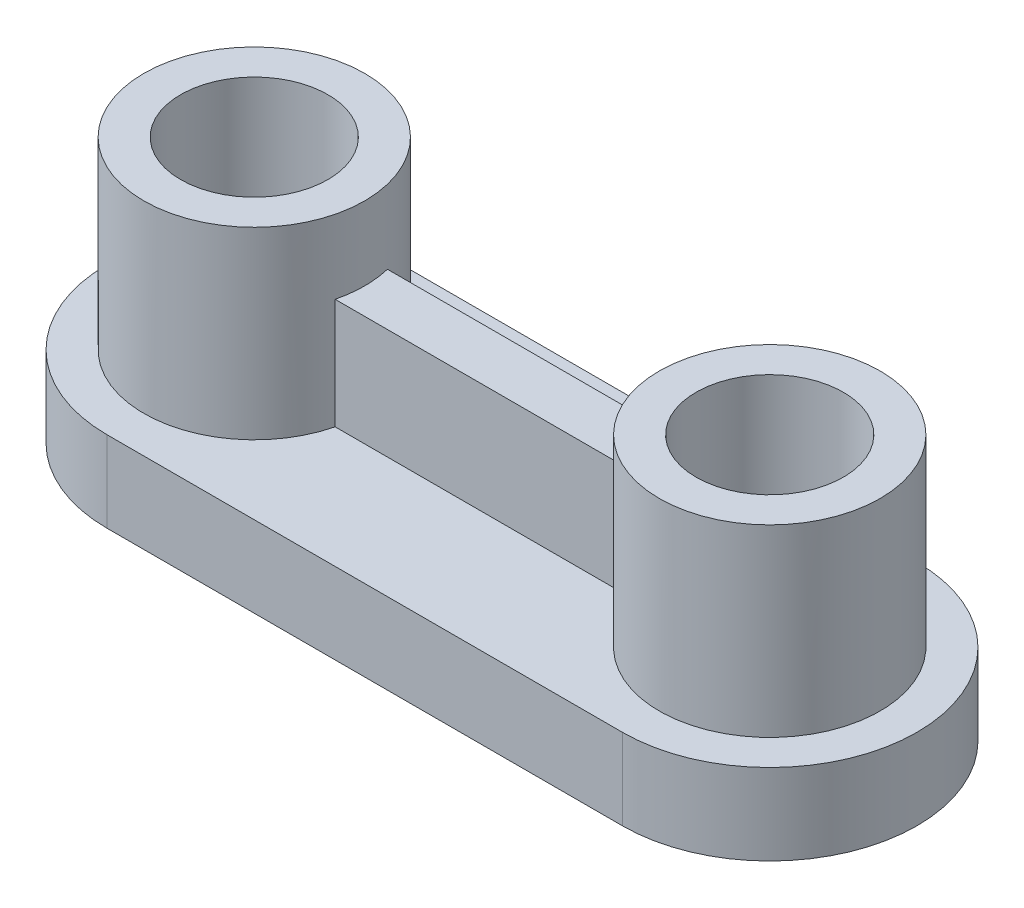
ISO-10303-21;
HEADER;
FILE_DESCRIPTION(('STEP AP214'),'2;1');
FILE_NAME('part.step','',(''),(''),'','','');
FILE_SCHEMA(('AUTOMOTIVE_DESIGN { 1 0 10303 214 1 1 1 1 }'));
ENDSEC;
DATA;
#1=APPLICATION_CONTEXT('core data for automotive mechanical design processes');
#2=APPLICATION_PROTOCOL_DEFINITION('international standard','automotive_design',2000,#1);
#3=PRODUCT_CONTEXT('',#1,'mechanical');
#4=PRODUCT('Part','Part','',(#3));
#5=PRODUCT_RELATED_PRODUCT_CATEGORY('part','',(#4));
#6=PRODUCT_DEFINITION_FORMATION('','',#4);
#7=PRODUCT_DEFINITION_CONTEXT('part definition',#1,'design');
#8=PRODUCT_DEFINITION('design','',#6,#7);
#9=PRODUCT_DEFINITION_SHAPE('','',#8);
#10=(LENGTH_UNIT() NAMED_UNIT(*) SI_UNIT(.MILLI.,.METRE.));
#11=(NAMED_UNIT(*) PLANE_ANGLE_UNIT() SI_UNIT($,.RADIAN.));
#12=(NAMED_UNIT(*) SI_UNIT($,.STERADIAN.) SOLID_ANGLE_UNIT());
#13=UNCERTAINTY_MEASURE_WITH_UNIT(LENGTH_MEASURE(1.E-05),#10,'distance_accuracy_value','');
#14=(GEOMETRIC_REPRESENTATION_CONTEXT(3) GLOBAL_UNCERTAINTY_ASSIGNED_CONTEXT((#13)) GLOBAL_UNIT_ASSIGNED_CONTEXT((#10,
#11,#12)) REPRESENTATION_CONTEXT('',''));
#15=CARTESIAN_POINT('',(0.,0.,0.));
#16=DIRECTION('',(0.,0.,1.));
#17=DIRECTION('',(1.,0.,0.));
#18=AXIS2_PLACEMENT_3D('',#15,#16,#17);
#19=CARTESIAN_POINT('',(-266.757890885161,11.,0.));
#20=DIRECTION('',(0.,-1.,0.));
#21=DIRECTION('',(0.,0.,-1.));
#22=AXIS2_PLACEMENT_3D('',#19,#20,#21);
#23=PLANE('',#22);
#24=CARTESIAN_POINT('',(-266.757890885161,11.,0.));
#25=DIRECTION('',(0.,-1.,0.));
#26=DIRECTION('',(0.,0.,-1.));
#27=AXIS2_PLACEMENT_3D('',#24,#25,#26);
#28=CIRCLE('',#27,20.);
#29=CARTESIAN_POINT('',(-266.757890885161,11.,20.));
#30=VERTEX_POINT('',#29);
#31=CARTESIAN_POINT('',(-266.757890885161,11.,-20.));
#32=VERTEX_POINT('',#31);
#33=EDGE_CURVE('E225',#30,#32,#28,.T.);
#34=ORIENTED_EDGE('',*,*,#33,.F.);
#35=DIRECTION('',(1.,0.,0.));
#36=VECTOR('',#35,1.);
#37=CARTESIAN_POINT('',(-266.757890885161,11.,20.));
#38=LINE('',#37,#36);
#39=CARTESIAN_POINT('',(-196.757890885161,11.,20.));
#40=VERTEX_POINT('',#39);
#41=EDGE_CURVE('E235',#30,#40,#38,.T.);
#42=ORIENTED_EDGE('',*,*,#41,.T.);
#43=CARTESIAN_POINT('',(-196.757890885161,11.,0.));
#44=DIRECTION('',(0.,-1.,0.));
#45=DIRECTION('',(0.,0.,-1.));
#46=AXIS2_PLACEMENT_3D('',#43,#44,#45);
#47=CIRCLE('',#46,20.);
#48=CARTESIAN_POINT('',(-196.757890885161,11.,-20.));
#49=VERTEX_POINT('',#48);
#50=EDGE_CURVE('E232',#49,#40,#47,.T.);
#51=ORIENTED_EDGE('',*,*,#50,.F.);
#52=DIRECTION('',(1.,0.,0.));
#53=VECTOR('',#52,1.);
#54=CARTESIAN_POINT('',(-266.757890885161,11.,-20.));
#55=LINE('',#54,#53);
#56=EDGE_CURVE('E228',#32,#49,#55,.T.);
#57=ORIENTED_EDGE('',*,*,#56,.F.);
#58=EDGE_LOOP('',(#34,#42,#51,#57));
#59=FACE_BOUND('',#58,.T.);
#60=DIRECTION('',(1.,0.,0.));
#61=VECTOR('',#60,1.);
#62=CARTESIAN_POINT('',(-252.192282910822,11.,3.58372213457869));
#63=LINE('',#62,#61);
#64=CARTESIAN_POINT('',(-252.192282910822,11.,3.58372213457861));
#65=VERTEX_POINT('',#64);
#66=CARTESIAN_POINT('',(-211.3234988595,11.,3.58372213457872));
#67=VERTEX_POINT('',#66);
#68=EDGE_CURVE('E171',#65,#67,#63,.T.);
#69=ORIENTED_EDGE('',*,*,#68,.F.);
#70=CARTESIAN_POINT('',(-266.757890885161,11.,0.));
#71=DIRECTION('',(0.,-1.,0.));
#72=DIRECTION('',(0.,0.,-1.));
#73=AXIS2_PLACEMENT_3D('',#70,#71,#72);
#74=CIRCLE('',#73,15.);
#75=CARTESIAN_POINT('',(-252.171938739346,11.,-3.49999999999999));
#76=VERTEX_POINT('',#75);
#77=EDGE_CURVE('E257',#76,#65,#74,.F.);
#78=ORIENTED_EDGE('',*,*,#77,.F.);
#79=DIRECTION('',(-1.,0.,0.));
#80=VECTOR('',#79,1.);
#81=CARTESIAN_POINT('',(-252.192282910822,11.,-3.5));
#82=LINE('',#81,#80);
#83=CARTESIAN_POINT('',(-211.343843030976,11.,-3.5));
#84=VERTEX_POINT('',#83);
#85=EDGE_CURVE('E179',#84,#76,#82,.T.);
#86=ORIENTED_EDGE('',*,*,#85,.F.);
#87=CARTESIAN_POINT('',(-196.757890885161,11.,0.));
#88=DIRECTION('',(0.,-1.,0.));
#89=DIRECTION('',(0.,0.,-1.));
#90=AXIS2_PLACEMENT_3D('',#87,#88,#89);
#91=CIRCLE('',#90,15.);
#92=EDGE_CURVE('E250',#67,#84,#91,.F.);
#93=ORIENTED_EDGE('',*,*,#92,.F.);
#94=EDGE_LOOP('',(#69,#78,#86,#93));
#95=FACE_BOUND('',#94,.T.);
#96=ADVANCED_FACE('F47',(#59,#95),#23,.F.);
#97=CARTESIAN_POINT('',(-196.757890885161,36.,0.));
#98=DIRECTION('',(0.,-1.,0.));
#99=DIRECTION('',(0.,0.,-1.));
#100=AXIS2_PLACEMENT_3D('',#97,#98,#99);
#101=CYLINDRICAL_SURFACE('',#100,15.);
#102=CARTESIAN_POINT('',(-196.757890885161,36.,0.));
#103=DIRECTION('',(0.,1.,0.));
#104=DIRECTION('',(0.,0.,1.));
#105=AXIS2_PLACEMENT_3D('',#102,#103,#104);
#106=CIRCLE('',#105,15.);
#107=CARTESIAN_POINT('',(-196.757890885161,36.,15.));
#108=VERTEX_POINT('',#107);
#109=EDGE_CURVE('E221',#108,#108,#106,.T.);
#110=ORIENTED_EDGE('',*,*,#109,.F.);
#111=EDGE_LOOP('',(#110));
#112=FACE_BOUND('',#111,.T.);
#113=DIRECTION('',(0.,-1.,0.));
#114=VECTOR('',#113,1.);
#115=CARTESIAN_POINT('',(-211.3234988595,26.,3.58372213457869));
#116=LINE('',#115,#114);
#117=CARTESIAN_POINT('',(-211.3234988595,26.,3.58372213457869));
#118=VERTEX_POINT('',#117);
#119=EDGE_CURVE('E189',#118,#67,#116,.T.);
#120=ORIENTED_EDGE('',*,*,#119,.T.);
#121=ORIENTED_EDGE('',*,*,#92,.T.);
#122=DIRECTION('',(0.,-1.,0.));
#123=VECTOR('',#122,1.);
#124=CARTESIAN_POINT('',(-211.343843030976,36.,-3.5));
#125=LINE('',#124,#123);
#126=CARTESIAN_POINT('',(-211.343843030976,26.,-3.5));
#127=VERTEX_POINT('',#126);
#128=EDGE_CURVE('E70',#127,#84,#125,.T.);
#129=ORIENTED_EDGE('',*,*,#128,.F.);
#130=CARTESIAN_POINT('',(-196.757890885161,26.,0.));
#131=DIRECTION('',(0.,-1.,0.));
#132=DIRECTION('',(0.,0.,-1.));
#133=AXIS2_PLACEMENT_3D('',#130,#131,#132);
#134=CIRCLE('',#133,15.);
#135=EDGE_CURVE('E191',#118,#127,#134,.T.);
#136=ORIENTED_EDGE('',*,*,#135,.F.);
#137=EDGE_LOOP('',(#120,#121,#129,#136));
#138=FACE_BOUND('',#137,.T.);
#139=ADVANCED_FACE('F269',(#112,#138),#101,.T.);
#140=CARTESIAN_POINT('',(-266.757890885161,36.,0.));
#141=DIRECTION('',(0.,-1.,0.));
#142=DIRECTION('',(0.,0.,-1.));
#143=AXIS2_PLACEMENT_3D('',#140,#141,#142);
#144=CYLINDRICAL_SURFACE('',#143,15.);
#145=CARTESIAN_POINT('',(-266.757890885161,36.,0.));
#146=DIRECTION('',(0.,1.,0.));
#147=DIRECTION('',(0.,0.,1.));
#148=AXIS2_PLACEMENT_3D('',#145,#146,#147);
#149=CIRCLE('',#148,15.);
#150=CARTESIAN_POINT('',(-266.757890885161,36.,15.));
#151=VERTEX_POINT('',#150);
#152=EDGE_CURVE('E210',#151,#151,#149,.T.);
#153=ORIENTED_EDGE('',*,*,#152,.F.);
#154=EDGE_LOOP('',(#153));
#155=FACE_BOUND('',#154,.T.);
#156=DIRECTION('',(0.,-1.,0.));
#157=VECTOR('',#156,1.);
#158=CARTESIAN_POINT('',(-252.171938739346,36.,-3.5));
#159=LINE('',#158,#157);
#160=CARTESIAN_POINT('',(-252.171938739346,26.,-3.5));
#161=VERTEX_POINT('',#160);
#162=EDGE_CURVE('E13',#76,#161,#159,.F.);
#163=ORIENTED_EDGE('',*,*,#162,.F.);
#164=ORIENTED_EDGE('',*,*,#77,.T.);
#165=DIRECTION('',(0.,-1.,0.));
#166=VECTOR('',#165,1.);
#167=CARTESIAN_POINT('',(-252.192282910822,26.,3.58372213457869));
#168=LINE('',#167,#166);
#169=CARTESIAN_POINT('',(-252.192282910822,26.,3.58372213457869));
#170=VERTEX_POINT('',#169);
#171=EDGE_CURVE('E182',#170,#65,#168,.T.);
#172=ORIENTED_EDGE('',*,*,#171,.F.);
#173=CARTESIAN_POINT('',(-266.757890885161,26.,0.));
#174=DIRECTION('',(0.,-1.,0.));
#175=DIRECTION('',(0.,0.,-1.));
#176=AXIS2_PLACEMENT_3D('',#173,#174,#175);
#177=CIRCLE('',#176,15.);
#178=EDGE_CURVE('E55',#161,#170,#177,.T.);
#179=ORIENTED_EDGE('',*,*,#178,.F.);
#180=EDGE_LOOP('',(#163,#164,#172,#179));
#181=FACE_BOUND('',#180,.T.);
#182=ADVANCED_FACE('F274',(#155,#181),#144,.T.);
#183=CARTESIAN_POINT('',(-266.757890885161,11.,0.));
#184=DIRECTION('',(0.,-1.,0.));
#185=DIRECTION('',(0.,0.,-1.));
#186=AXIS2_PLACEMENT_3D('',#183,#184,#185);
#187=CYLINDRICAL_SURFACE('',#186,20.);
#188=CARTESIAN_POINT('',(-266.757890885161,0.,0.));
#189=DIRECTION('',(0.,-1.,0.));
#190=DIRECTION('',(0.,0.,-1.));
#191=AXIS2_PLACEMENT_3D('',#188,#189,#190);
#192=CIRCLE('',#191,20.);
#193=CARTESIAN_POINT('',(-266.757890885161,0.,20.));
#194=VERTEX_POINT('',#193);
#195=CARTESIAN_POINT('',(-266.757890885161,0.,-20.));
#196=VERTEX_POINT('',#195);
#197=EDGE_CURVE('E224',#194,#196,#192,.T.);
#198=ORIENTED_EDGE('',*,*,#197,.F.);
#199=DIRECTION('',(0.,-1.,0.));
#200=VECTOR('',#199,1.);
#201=CARTESIAN_POINT('',(-266.757890885161,11.,20.));
#202=LINE('',#201,#200);
#203=EDGE_CURVE('E248',#30,#194,#202,.T.);
#204=ORIENTED_EDGE('',*,*,#203,.F.);
#205=ORIENTED_EDGE('',*,*,#33,.T.);
#206=DIRECTION('',(0.,-1.,0.));
#207=VECTOR('',#206,1.);
#208=CARTESIAN_POINT('',(-266.757890885161,11.,-20.));
#209=LINE('',#208,#207);
#210=EDGE_CURVE('E237',#32,#196,#209,.T.);
#211=ORIENTED_EDGE('',*,*,#210,.T.);
#212=EDGE_LOOP('',(#198,#204,#205,#211));
#213=FACE_BOUND('',#212,.T.);
#214=ADVANCED_FACE('F49',(#213),#187,.T.);
#215=CARTESIAN_POINT('',(-266.757890885161,11.,20.));
#216=DIRECTION('',(0.,0.,-1.));
#217=DIRECTION('',(-1.,0.,0.));
#218=AXIS2_PLACEMENT_3D('',#215,#216,#217);
#219=PLANE('',#218);
#220=DIRECTION('',(1.,0.,0.));
#221=VECTOR('',#220,1.);
#222=CARTESIAN_POINT('',(-266.757890885161,0.,20.));
#223=LINE('',#222,#221);
#224=CARTESIAN_POINT('',(-196.757890885161,0.,20.));
#225=VERTEX_POINT('',#224);
#226=EDGE_CURVE('E229',#194,#225,#223,.T.);
#227=ORIENTED_EDGE('',*,*,#226,.T.);
#228=DIRECTION('',(0.,-1.,0.));
#229=VECTOR('',#228,1.);
#230=CARTESIAN_POINT('',(-196.757890885161,11.,20.));
#231=LINE('',#230,#229);
#232=EDGE_CURVE('E251',#40,#225,#231,.T.);
#233=ORIENTED_EDGE('',*,*,#232,.F.);
#234=ORIENTED_EDGE('',*,*,#41,.F.);
#235=ORIENTED_EDGE('',*,*,#203,.T.);
#236=EDGE_LOOP('',(#227,#233,#234,#235));
#237=FACE_BOUND('',#236,.T.);
#238=ADVANCED_FACE('F282',(#237),#219,.F.);
#239=CARTESIAN_POINT('',(-196.757890885161,11.,0.));
#240=DIRECTION('',(0.,-1.,0.));
#241=DIRECTION('',(0.,0.,-1.));
#242=AXIS2_PLACEMENT_3D('',#239,#240,#241);
#243=CYLINDRICAL_SURFACE('',#242,20.);
#244=CARTESIAN_POINT('',(-196.757890885161,0.,0.));
#245=DIRECTION('',(0.,-1.,0.));
#246=DIRECTION('',(0.,0.,-1.));
#247=AXIS2_PLACEMENT_3D('',#244,#245,#246);
#248=CIRCLE('',#247,20.);
#249=CARTESIAN_POINT('',(-196.757890885161,0.,-20.));
#250=VERTEX_POINT('',#249);
#251=EDGE_CURVE('E243',#250,#225,#248,.T.);
#252=ORIENTED_EDGE('',*,*,#251,.F.);
#253=DIRECTION('',(0.,-1.,0.));
#254=VECTOR('',#253,1.);
#255=CARTESIAN_POINT('',(-196.757890885161,11.,-20.));
#256=LINE('',#255,#254);
#257=EDGE_CURVE('E253',#49,#250,#256,.T.);
#258=ORIENTED_EDGE('',*,*,#257,.F.);
#259=ORIENTED_EDGE('',*,*,#50,.T.);
#260=ORIENTED_EDGE('',*,*,#232,.T.);
#261=EDGE_LOOP('',(#252,#258,#259,#260));
#262=FACE_BOUND('',#261,.T.);
#263=ADVANCED_FACE('F305',(#262),#243,.T.);
#264=CARTESIAN_POINT('',(-266.757890885161,11.,-20.));
#265=DIRECTION('',(0.,0.,-1.));
#266=DIRECTION('',(-1.,0.,0.));
#267=AXIS2_PLACEMENT_3D('',#264,#265,#266);
#268=PLANE('',#267);
#269=DIRECTION('',(1.,0.,0.));
#270=VECTOR('',#269,1.);
#271=CARTESIAN_POINT('',(-266.757890885161,0.,-20.));
#272=LINE('',#271,#270);
#273=EDGE_CURVE('E240',#196,#250,#272,.T.);
#274=ORIENTED_EDGE('',*,*,#273,.F.);
#275=ORIENTED_EDGE('',*,*,#210,.F.);
#276=ORIENTED_EDGE('',*,*,#56,.T.);
#277=ORIENTED_EDGE('',*,*,#257,.T.);
#278=EDGE_LOOP('',(#274,#275,#276,#277));
#279=FACE_BOUND('',#278,.T.);
#280=ADVANCED_FACE('F301',(#279),#268,.T.);
#281=CARTESIAN_POINT('',(-266.757890885161,0.,0.));
#282=DIRECTION('',(0.,-1.,0.));
#283=DIRECTION('',(0.,0.,-1.));
#284=AXIS2_PLACEMENT_3D('',#281,#282,#283);
#285=PLANE('',#284);
#286=DIRECTION('',(0.,0.,-1.));
#287=VECTOR('',#286,1.);
#288=CARTESIAN_POINT('',(-249.107838077498,0.,9.0234454978545));
#289=LINE('',#288,#287);
#290=CARTESIAN_POINT('',(-249.107838077498,0.,9.0234454978545));
#291=VERTEX_POINT('',#290);
#292=CARTESIAN_POINT('',(-249.107838077498,0.,-8.9765545021455));
#293=VERTEX_POINT('',#292);
#294=EDGE_CURVE('E62',#291,#293,#289,.T.);
#295=ORIENTED_EDGE('',*,*,#294,.F.);
#296=DIRECTION('',(1.,0.,0.));
#297=VECTOR('',#296,1.);
#298=CARTESIAN_POINT('',(-249.107838077498,0.,9.0234454978545));
#299=LINE('',#298,#297);
#300=CARTESIAN_POINT('',(-213.107838077498,0.,9.0234454978545));
#301=VERTEX_POINT('',#300);
#302=EDGE_CURVE('E156',#291,#301,#299,.T.);
#303=ORIENTED_EDGE('',*,*,#302,.T.);
#304=DIRECTION('',(0.,0.,-1.));
#305=VECTOR('',#304,1.);
#306=CARTESIAN_POINT('',(-213.107838077498,0.,9.0234454978545));
#307=LINE('',#306,#305);
#308=CARTESIAN_POINT('',(-213.107838077498,0.,-8.9765545021455));
#309=VERTEX_POINT('',#308);
#310=EDGE_CURVE('E159',#301,#309,#307,.T.);
#311=ORIENTED_EDGE('',*,*,#310,.T.);
#312=DIRECTION('',(1.,0.,0.));
#313=VECTOR('',#312,1.);
#314=CARTESIAN_POINT('',(-249.107838077498,0.,-8.9765545021455));
#315=LINE('',#314,#313);
#316=EDGE_CURVE('E165',#293,#309,#315,.T.);
#317=ORIENTED_EDGE('',*,*,#316,.F.);
#318=EDGE_LOOP('',(#295,#303,#311,#317));
#319=FACE_BOUND('',#318,.T.);
#320=CARTESIAN_POINT('',(-196.757890885161,0.,0.));
#321=DIRECTION('',(0.,1.,0.));
#322=DIRECTION('',(0.,0.,1.));
#323=AXIS2_PLACEMENT_3D('',#320,#321,#322);
#324=CIRCLE('',#323,7.50000000000001);
#325=CARTESIAN_POINT('',(-196.757890885161,0.,7.50000000000001));
#326=VERTEX_POINT('',#325);
#327=EDGE_CURVE('E195',#326,#326,#324,.T.);
#328=ORIENTED_EDGE('',*,*,#327,.T.);
#329=EDGE_LOOP('',(#328));
#330=FACE_BOUND('',#329,.T.);
#331=CARTESIAN_POINT('',(-266.757890885161,0.,0.));
#332=DIRECTION('',(0.,1.,0.));
#333=DIRECTION('',(0.,0.,1.));
#334=AXIS2_PLACEMENT_3D('',#331,#332,#333);
#335=CIRCLE('',#334,7.50000000000001);
#336=CARTESIAN_POINT('',(-266.757890885161,0.,7.50000000000001));
#337=VERTEX_POINT('',#336);
#338=EDGE_CURVE('E202',#337,#337,#335,.T.);
#339=ORIENTED_EDGE('',*,*,#338,.T.);
#340=EDGE_LOOP('',(#339));
#341=FACE_BOUND('',#340,.T.);
#342=ORIENTED_EDGE('',*,*,#197,.T.);
#343=ORIENTED_EDGE('',*,*,#273,.T.);
#344=ORIENTED_EDGE('',*,*,#251,.T.);
#345=ORIENTED_EDGE('',*,*,#226,.F.);
#346=EDGE_LOOP('',(#342,#343,#344,#345));
#347=FACE_BOUND('',#346,.T.);
#348=ADVANCED_FACE('F297',(#319,#330,#341,#347),#285,.T.);
#349=CARTESIAN_POINT('',(-196.757890885161,36.,0.));
#350=DIRECTION('',(0.,1.,0.));
#351=DIRECTION('',(0.,0.,1.));
#352=AXIS2_PLACEMENT_3D('',#349,#350,#351);
#353=PLANE('',#352);
#354=CARTESIAN_POINT('',(-196.757890885161,36.,0.));
#355=DIRECTION('',(0.,1.,0.));
#356=DIRECTION('',(0.,0.,1.));
#357=AXIS2_PLACEMENT_3D('',#354,#355,#356);
#358=CIRCLE('',#357,10.);
#359=CARTESIAN_POINT('',(-196.757890885161,36.,10.));
#360=VERTEX_POINT('',#359);
#361=EDGE_CURVE('E198',#360,#360,#358,.T.);
#362=ORIENTED_EDGE('',*,*,#361,.F.);
#363=EDGE_LOOP('',(#362));
#364=FACE_BOUND('',#363,.T.);
#365=ORIENTED_EDGE('',*,*,#109,.T.);
#366=EDGE_LOOP('',(#365));
#367=FACE_BOUND('',#366,.T.);
#368=ADVANCED_FACE('F300',(#364,#367),#353,.T.);
#369=CARTESIAN_POINT('',(-266.757890885161,36.,0.));
#370=DIRECTION('',(0.,1.,0.));
#371=DIRECTION('',(0.,0.,1.));
#372=AXIS2_PLACEMENT_3D('',#369,#370,#371);
#373=PLANE('',#372);
#374=CARTESIAN_POINT('',(-266.757890885161,36.,0.));
#375=DIRECTION('',(0.,1.,0.));
#376=DIRECTION('',(0.,0.,1.));
#377=AXIS2_PLACEMENT_3D('',#374,#375,#376);
#378=CIRCLE('',#377,9.99999999999998);
#379=CARTESIAN_POINT('',(-266.757890885161,36.,9.99999999999998));
#380=VERTEX_POINT('',#379);
#381=EDGE_CURVE('E211',#380,#380,#378,.T.);
#382=ORIENTED_EDGE('',*,*,#381,.F.);
#383=EDGE_LOOP('',(#382));
#384=FACE_BOUND('',#383,.T.);
#385=ORIENTED_EDGE('',*,*,#152,.T.);
#386=EDGE_LOOP('',(#385));
#387=FACE_BOUND('',#386,.T.);
#388=ADVANCED_FACE('F336',(#384,#387),#373,.T.);
#389=CARTESIAN_POINT('',(-266.757890885161,16.,0.));
#390=DIRECTION('',(0.,1.,0.));
#391=DIRECTION('',(0.,0.,1.));
#392=AXIS2_PLACEMENT_3D('',#389,#390,#391);
#393=CYLINDRICAL_SURFACE('',#392,9.99999999999998);
#394=CARTESIAN_POINT('',(-266.757890885161,16.,0.));
#395=DIRECTION('',(0.,1.,0.));
#396=DIRECTION('',(0.,0.,1.));
#397=AXIS2_PLACEMENT_3D('',#394,#395,#396);
#398=CIRCLE('',#397,9.99999999999998);
#399=CARTESIAN_POINT('',(-266.757890885161,16.,9.99999999999998));
#400=VERTEX_POINT('',#399);
#401=EDGE_CURVE('E207',#400,#400,#398,.T.);
#402=ORIENTED_EDGE('',*,*,#401,.F.);
#403=EDGE_LOOP('',(#402));
#404=FACE_BOUND('',#403,.T.);
#405=ORIENTED_EDGE('',*,*,#381,.T.);
#406=EDGE_LOOP('',(#405));
#407=FACE_BOUND('',#406,.T.);
#408=ADVANCED_FACE('F343',(#404,#407),#393,.F.);
#409=CARTESIAN_POINT('',(-266.757890885161,16.,0.));
#410=DIRECTION('',(0.,1.,0.));
#411=DIRECTION('',(0.,0.,1.));
#412=AXIS2_PLACEMENT_3D('',#409,#410,#411);
#413=PLANE('',#412);
#414=CARTESIAN_POINT('',(-266.757890885161,16.,0.));
#415=DIRECTION('',(0.,1.,0.));
#416=DIRECTION('',(0.,0.,1.));
#417=AXIS2_PLACEMENT_3D('',#414,#415,#416);
#418=CIRCLE('',#417,7.50000000000001);
#419=CARTESIAN_POINT('',(-266.757890885161,16.,7.50000000000001));
#420=VERTEX_POINT('',#419);
#421=EDGE_CURVE('E194',#420,#420,#418,.T.);
#422=ORIENTED_EDGE('',*,*,#421,.F.);
#423=EDGE_LOOP('',(#422));
#424=FACE_BOUND('',#423,.T.);
#425=ORIENTED_EDGE('',*,*,#401,.T.);
#426=EDGE_LOOP('',(#425));
#427=FACE_BOUND('',#426,.T.);
#428=ADVANCED_FACE('F350',(#424,#427),#413,.T.);
#429=CARTESIAN_POINT('',(-196.757890885161,16.,0.));
#430=DIRECTION('',(0.,1.,0.));
#431=DIRECTION('',(0.,0.,1.));
#432=AXIS2_PLACEMENT_3D('',#429,#430,#431);
#433=CYLINDRICAL_SURFACE('',#432,10.);
#434=CARTESIAN_POINT('',(-196.757890885161,16.,0.));
#435=DIRECTION('',(0.,1.,0.));
#436=DIRECTION('',(0.,0.,1.));
#437=AXIS2_PLACEMENT_3D('',#434,#435,#436);
#438=CIRCLE('',#437,10.);
#439=CARTESIAN_POINT('',(-196.757890885161,16.,10.));
#440=VERTEX_POINT('',#439);
#441=EDGE_CURVE('E214',#440,#440,#438,.T.);
#442=ORIENTED_EDGE('',*,*,#441,.F.);
#443=EDGE_LOOP('',(#442));
#444=FACE_BOUND('',#443,.T.);
#445=ORIENTED_EDGE('',*,*,#361,.T.);
#446=EDGE_LOOP('',(#445));
#447=FACE_BOUND('',#446,.T.);
#448=ADVANCED_FACE('F359',(#444,#447),#433,.F.);
#449=CARTESIAN_POINT('',(-196.757890885161,16.,0.));
#450=DIRECTION('',(0.,1.,0.));
#451=DIRECTION('',(0.,0.,1.));
#452=AXIS2_PLACEMENT_3D('',#449,#450,#451);
#453=PLANE('',#452);
#454=CARTESIAN_POINT('',(-196.757890885161,16.,0.));
#455=DIRECTION('',(0.,1.,0.));
#456=DIRECTION('',(0.,0.,1.));
#457=AXIS2_PLACEMENT_3D('',#454,#455,#456);
#458=CIRCLE('',#457,7.50000000000001);
#459=CARTESIAN_POINT('',(-196.757890885161,16.,7.50000000000001));
#460=VERTEX_POINT('',#459);
#461=EDGE_CURVE('E199',#460,#460,#458,.T.);
#462=ORIENTED_EDGE('',*,*,#461,.F.);
#463=EDGE_LOOP('',(#462));
#464=FACE_BOUND('',#463,.T.);
#465=ORIENTED_EDGE('',*,*,#441,.T.);
#466=EDGE_LOOP('',(#465));
#467=FACE_BOUND('',#466,.T.);
#468=ADVANCED_FACE('F367',(#464,#467),#453,.T.);
#469=CARTESIAN_POINT('',(-266.757890885161,0.,0.));
#470=DIRECTION('',(0.,1.,0.));
#471=DIRECTION('',(0.,0.,1.));
#472=AXIS2_PLACEMENT_3D('',#469,#470,#471);
#473=CYLINDRICAL_SURFACE('',#472,7.50000000000001);
#474=ORIENTED_EDGE('',*,*,#338,.F.);
#475=EDGE_LOOP('',(#474));
#476=FACE_BOUND('',#475,.T.);
#477=ORIENTED_EDGE('',*,*,#421,.T.);
#478=EDGE_LOOP('',(#477));
#479=FACE_BOUND('',#478,.T.);
#480=ADVANCED_FACE('F373',(#476,#479),#473,.F.);
#481=CARTESIAN_POINT('',(-196.757890885161,0.,0.));
#482=DIRECTION('',(0.,1.,0.));
#483=DIRECTION('',(0.,0.,1.));
#484=AXIS2_PLACEMENT_3D('',#481,#482,#483);
#485=CYLINDRICAL_SURFACE('',#484,7.50000000000001);
#486=ORIENTED_EDGE('',*,*,#327,.F.);
#487=EDGE_LOOP('',(#486));
#488=FACE_BOUND('',#487,.T.);
#489=ORIENTED_EDGE('',*,*,#461,.T.);
#490=EDGE_LOOP('',(#489));
#491=FACE_BOUND('',#490,.T.);
#492=ADVANCED_FACE('F381',(#488,#491),#485,.F.);
#493=CARTESIAN_POINT('',(-252.192282910822,26.,-3.5));
#494=DIRECTION('',(0.,0.,1.));
#495=DIRECTION('',(1.,0.,0.));
#496=AXIS2_PLACEMENT_3D('',#493,#494,#495);
#497=PLANE('',#496);
#498=DIRECTION('',(-1.,0.,0.));
#499=VECTOR('',#498,1.);
#500=CARTESIAN_POINT('',(-252.192282910822,26.,-3.5));
#501=LINE('',#500,#499);
#502=EDGE_CURVE('E178',#127,#161,#501,.T.);
#503=ORIENTED_EDGE('',*,*,#502,.F.);
#504=ORIENTED_EDGE('',*,*,#128,.T.);
#505=ORIENTED_EDGE('',*,*,#85,.T.);
#506=ORIENTED_EDGE('',*,*,#162,.T.);
#507=EDGE_LOOP('',(#503,#504,#505,#506));
#508=FACE_BOUND('',#507,.T.);
#509=ADVANCED_FACE('F273',(#508),#497,.F.);
#510=CARTESIAN_POINT('',(-252.192282910822,26.,3.58372213457869));
#511=DIRECTION('',(0.,0.,-1.));
#512=DIRECTION('',(-1.,0.,0.));
#513=AXIS2_PLACEMENT_3D('',#510,#511,#512);
#514=PLANE('',#513);
#515=ORIENTED_EDGE('',*,*,#68,.T.);
#516=ORIENTED_EDGE('',*,*,#119,.F.);
#517=DIRECTION('',(1.,0.,0.));
#518=VECTOR('',#517,1.);
#519=CARTESIAN_POINT('',(-252.192282910822,26.,3.58372213457869));
#520=LINE('',#519,#518);
#521=EDGE_CURVE('E175',#170,#118,#520,.T.);
#522=ORIENTED_EDGE('',*,*,#521,.F.);
#523=ORIENTED_EDGE('',*,*,#171,.T.);
#524=EDGE_LOOP('',(#515,#516,#522,#523));
#525=FACE_BOUND('',#524,.T.);
#526=ADVANCED_FACE('F267',(#525),#514,.F.);
#527=CARTESIAN_POINT('',(0.,26.,0.));
#528=DIRECTION('',(0.,-1.,0.));
#529=DIRECTION('',(0.,0.,-1.));
#530=AXIS2_PLACEMENT_3D('',#527,#528,#529);
#531=PLANE('',#530);
#532=ORIENTED_EDGE('',*,*,#521,.T.);
#533=ORIENTED_EDGE('',*,*,#135,.T.);
#534=ORIENTED_EDGE('',*,*,#502,.T.);
#535=ORIENTED_EDGE('',*,*,#178,.T.);
#536=EDGE_LOOP('',(#532,#533,#534,#535));
#537=FACE_BOUND('',#536,.T.);
#538=ADVANCED_FACE('F262',(#537),#531,.F.);
#539=CARTESIAN_POINT('',(-249.107838077498,5.,9.0234454978545));
#540=DIRECTION('',(-1.,0.,0.));
#541=DIRECTION('',(0.,0.,1.));
#542=AXIS2_PLACEMENT_3D('',#539,#540,#541);
#543=PLANE('',#542);
#544=ORIENTED_EDGE('',*,*,#294,.T.);
#545=DIRECTION('',(0.,-1.,0.));
#546=VECTOR('',#545,1.);
#547=CARTESIAN_POINT('',(-249.107838077498,5.,-8.9765545021455));
#548=LINE('',#547,#546);
#549=CARTESIAN_POINT('',(-249.107838077498,5.,-8.9765545021455));
#550=VERTEX_POINT('',#549);
#551=EDGE_CURVE('E135',#550,#293,#548,.T.);
#552=ORIENTED_EDGE('',*,*,#551,.F.);
#553=DIRECTION('',(0.,0.,-1.));
#554=VECTOR('',#553,1.);
#555=CARTESIAN_POINT('',(-249.107838077498,5.,9.0234454978545));
#556=LINE('',#555,#554);
#557=CARTESIAN_POINT('',(-249.107838077498,5.,9.0234454978545));
#558=VERTEX_POINT('',#557);
#559=EDGE_CURVE('E139',#558,#550,#556,.T.);
#560=ORIENTED_EDGE('',*,*,#559,.F.);
#561=DIRECTION('',(0.,-1.,0.));
#562=VECTOR('',#561,1.);
#563=CARTESIAN_POINT('',(-249.107838077498,5.,9.0234454978545));
#564=LINE('',#563,#562);
#565=EDGE_CURVE('E169',#558,#291,#564,.T.);
#566=ORIENTED_EDGE('',*,*,#565,.T.);
#567=EDGE_LOOP('',(#544,#552,#560,#566));
#568=FACE_BOUND('',#567,.T.);
#569=ADVANCED_FACE('F137',(#568),#543,.F.);
#570=CARTESIAN_POINT('',(-249.107838077498,5.,9.0234454978545));
#571=DIRECTION('',(0.,0.,-1.));
#572=DIRECTION('',(-1.,0.,0.));
#573=AXIS2_PLACEMENT_3D('',#570,#571,#572);
#574=PLANE('',#573);
#575=ORIENTED_EDGE('',*,*,#302,.F.);
#576=ORIENTED_EDGE('',*,*,#565,.F.);
#577=DIRECTION('',(1.,0.,0.));
#578=VECTOR('',#577,1.);
#579=CARTESIAN_POINT('',(-249.107838077498,5.,9.0234454978545));
#580=LINE('',#579,#578);
#581=CARTESIAN_POINT('',(-213.107838077498,5.,9.0234454978545));
#582=VERTEX_POINT('',#581);
#583=EDGE_CURVE('E144',#558,#582,#580,.T.);
#584=ORIENTED_EDGE('',*,*,#583,.T.);
#585=DIRECTION('',(0.,-1.,0.));
#586=VECTOR('',#585,1.);
#587=CARTESIAN_POINT('',(-213.107838077498,5.,9.0234454978545));
#588=LINE('',#587,#586);
#589=EDGE_CURVE('E172',#582,#301,#588,.T.);
#590=ORIENTED_EDGE('',*,*,#589,.T.);
#591=EDGE_LOOP('',(#575,#576,#584,#590));
#592=FACE_BOUND('',#591,.T.);
#593=ADVANCED_FACE('F412',(#592),#574,.T.);
#594=CARTESIAN_POINT('',(-213.107838077498,5.,9.0234454978545));
#595=DIRECTION('',(-1.,0.,0.));
#596=DIRECTION('',(0.,0.,1.));
#597=AXIS2_PLACEMENT_3D('',#594,#595,#596);
#598=PLANE('',#597);
#599=ORIENTED_EDGE('',*,*,#310,.F.);
#600=ORIENTED_EDGE('',*,*,#589,.F.);
#601=DIRECTION('',(0.,0.,-1.));
#602=VECTOR('',#601,1.);
#603=CARTESIAN_POINT('',(-213.107838077498,5.,9.0234454978545));
#604=LINE('',#603,#602);
#605=CARTESIAN_POINT('',(-213.107838077498,5.,-8.9765545021455));
#606=VERTEX_POINT('',#605);
#607=EDGE_CURVE('E152',#582,#606,#604,.T.);
#608=ORIENTED_EDGE('',*,*,#607,.T.);
#609=DIRECTION('',(0.,-1.,0.));
#610=VECTOR('',#609,1.);
#611=CARTESIAN_POINT('',(-213.107838077498,5.,-8.9765545021455));
#612=LINE('',#611,#610);
#613=EDGE_CURVE('E143',#606,#309,#612,.T.);
#614=ORIENTED_EDGE('',*,*,#613,.T.);
#615=EDGE_LOOP('',(#599,#600,#608,#614));
#616=FACE_BOUND('',#615,.T.);
#617=ADVANCED_FACE('F419',(#616),#598,.T.);
#618=CARTESIAN_POINT('',(-249.107838077498,5.,-8.9765545021455));
#619=DIRECTION('',(0.,0.,-1.));
#620=DIRECTION('',(-1.,0.,0.));
#621=AXIS2_PLACEMENT_3D('',#618,#619,#620);
#622=PLANE('',#621);
#623=ORIENTED_EDGE('',*,*,#316,.T.);
#624=ORIENTED_EDGE('',*,*,#613,.F.);
#625=DIRECTION('',(1.,0.,0.));
#626=VECTOR('',#625,1.);
#627=CARTESIAN_POINT('',(-249.107838077498,5.,-8.9765545021455));
#628=LINE('',#627,#626);
#629=EDGE_CURVE('E148',#550,#606,#628,.T.);
#630=ORIENTED_EDGE('',*,*,#629,.F.);
#631=ORIENTED_EDGE('',*,*,#551,.T.);
#632=EDGE_LOOP('',(#623,#624,#630,#631));
#633=FACE_BOUND('',#632,.T.);
#634=ADVANCED_FACE('F149',(#633),#622,.F.);
#635=CARTESIAN_POINT('',(0.,5.,0.));
#636=DIRECTION('',(0.,-1.,0.));
#637=DIRECTION('',(0.,0.,-1.));
#638=AXIS2_PLACEMENT_3D('',#635,#636,#637);
#639=PLANE('',#638);
#640=ORIENTED_EDGE('',*,*,#559,.T.);
#641=ORIENTED_EDGE('',*,*,#629,.T.);
#642=ORIENTED_EDGE('',*,*,#607,.F.);
#643=ORIENTED_EDGE('',*,*,#583,.F.);
#644=EDGE_LOOP('',(#640,#641,#642,#643));
#645=FACE_BOUND('',#644,.T.);
#646=ADVANCED_FACE('F155',(#645),#639,.T.);
#647=CLOSED_SHELL('',(#96,#139,#182,#214,#238,#263,#280,#348,#368,#388,#408,#428,#448,#468,#480,
#492,#509,#526,#538,#569,#593,#617,#634,#646));
#648=MANIFOLD_SOLID_BREP('B2',#647);
#649=ADVANCED_BREP_SHAPE_REPRESENTATION('',(#18,#648),#14);
#650=SHAPE_DEFINITION_REPRESENTATION(#9,#649);
ENDSEC;
END-ISO-10303-21;
